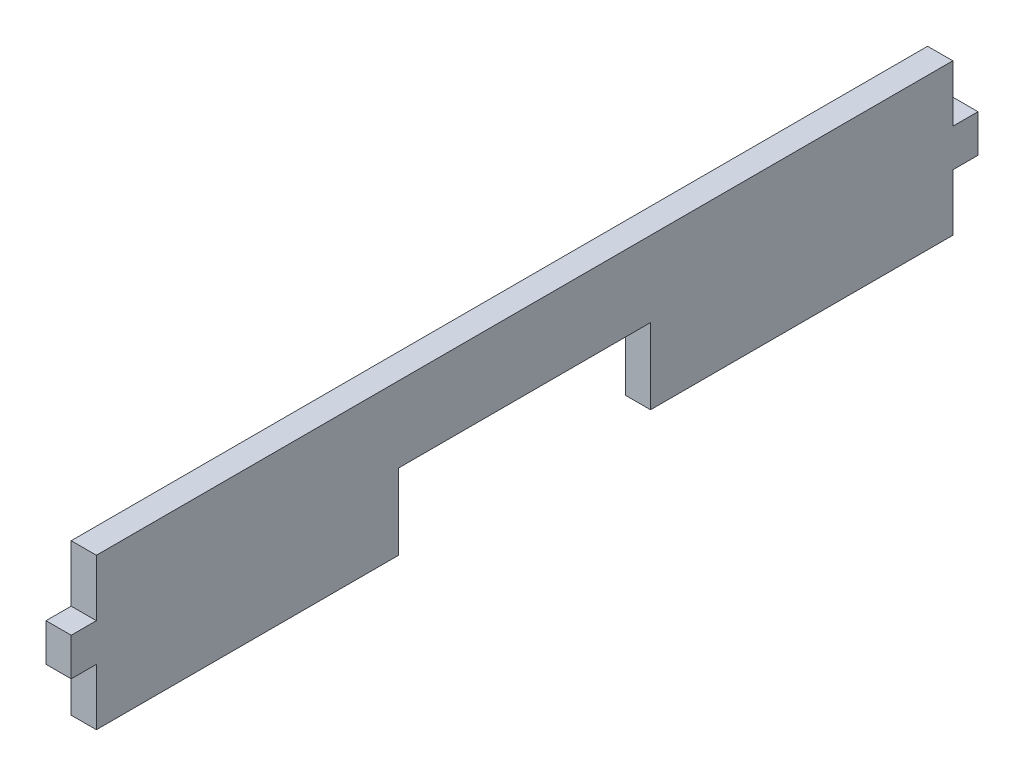
ISO-10303-21;
HEADER;
FILE_DESCRIPTION(('STEP AP214'),'2;1');
FILE_NAME('part.step','',(''),(''),'','','');
FILE_SCHEMA(('AUTOMOTIVE_DESIGN { 1 0 10303 214 1 1 1 1 }'));
ENDSEC;
DATA;
#1=APPLICATION_CONTEXT('core data for automotive mechanical design processes');
#2=APPLICATION_PROTOCOL_DEFINITION('international standard','automotive_design',2000,#1);
#3=PRODUCT_CONTEXT('',#1,'mechanical');
#4=PRODUCT('Part','Part','',(#3));
#5=PRODUCT_RELATED_PRODUCT_CATEGORY('part','',(#4));
#6=PRODUCT_DEFINITION_FORMATION('','',#4);
#7=PRODUCT_DEFINITION_CONTEXT('part definition',#1,'design');
#8=PRODUCT_DEFINITION('design','',#6,#7);
#9=PRODUCT_DEFINITION_SHAPE('','',#8);
#10=(LENGTH_UNIT() NAMED_UNIT(*) SI_UNIT(.MILLI.,.METRE.));
#11=(NAMED_UNIT(*) PLANE_ANGLE_UNIT() SI_UNIT($,.RADIAN.));
#12=(NAMED_UNIT(*) SI_UNIT($,.STERADIAN.) SOLID_ANGLE_UNIT());
#13=UNCERTAINTY_MEASURE_WITH_UNIT(LENGTH_MEASURE(1.E-05),#10,'distance_accuracy_value','');
#14=(GEOMETRIC_REPRESENTATION_CONTEXT(3) GLOBAL_UNCERTAINTY_ASSIGNED_CONTEXT((#13)) GLOBAL_UNIT_ASSIGNED_CONTEXT((#10,
#11,#12)) REPRESENTATION_CONTEXT('',''));
#15=CARTESIAN_POINT('',(0.,0.,0.));
#16=DIRECTION('',(0.,0.,1.));
#17=DIRECTION('',(1.,0.,0.));
#18=AXIS2_PLACEMENT_3D('',#15,#16,#17);
#19=CARTESIAN_POINT('',(2.54,-7.62,43.18));
#20=DIRECTION('',(0.,1.,0.));
#21=DIRECTION('',(0.,0.,1.));
#22=AXIS2_PLACEMENT_3D('',#19,#20,#21);
#23=PLANE('',#22);
#24=DIRECTION('',(0.,0.,-1.));
#25=VECTOR('',#24,1.);
#26=CARTESIAN_POINT('',(2.54,-7.62,43.18));
#27=LINE('',#26,#25);
#28=CARTESIAN_POINT('',(2.54,-7.62,-12.7));
#29=VERTEX_POINT('',#28);
#30=CARTESIAN_POINT('',(2.54,-7.62,-43.18));
#31=VERTEX_POINT('',#30);
#32=EDGE_CURVE('E58',#29,#31,#27,.T.);
#33=ORIENTED_EDGE('',*,*,#32,.F.);
#34=DIRECTION('',(1.,0.,0.));
#35=VECTOR('',#34,1.);
#36=CARTESIAN_POINT('',(-0.00100000000000013,-7.62,-12.7));
#37=LINE('',#36,#35);
#38=CARTESIAN_POINT('',(0.,-7.62,-12.7));
#39=VERTEX_POINT('',#38);
#40=EDGE_CURVE('E287',#39,#29,#37,.T.);
#41=ORIENTED_EDGE('',*,*,#40,.F.);
#42=DIRECTION('',(0.,0.,-1.));
#43=VECTOR('',#42,1.);
#44=CARTESIAN_POINT('',(0.,-7.62,43.18));
#45=LINE('',#44,#43);
#46=CARTESIAN_POINT('',(0.,-7.62,-43.18));
#47=VERTEX_POINT('',#46);
#48=EDGE_CURVE('E104',#39,#47,#45,.T.);
#49=ORIENTED_EDGE('',*,*,#48,.T.);
#50=DIRECTION('',(-1.,0.,0.));
#51=VECTOR('',#50,1.);
#52=CARTESIAN_POINT('',(2.54,-7.62,-43.18));
#53=LINE('',#52,#51);
#54=EDGE_CURVE('E170',#31,#47,#53,.T.);
#55=ORIENTED_EDGE('',*,*,#54,.F.);
#56=EDGE_LOOP('',(#33,#41,#49,#55));
#57=FACE_BOUND('',#56,.T.);
#58=ADVANCED_FACE('F34',(#57),#23,.F.);
#59=CARTESIAN_POINT('',(2.54,-1.90500000000001,-43.18));
#60=DIRECTION('',(0.,0.,1.));
#61=DIRECTION('',(1.,0.,0.));
#62=AXIS2_PLACEMENT_3D('',#59,#60,#61);
#63=PLANE('',#62);
#64=DIRECTION('',(0.,1.,0.));
#65=VECTOR('',#64,1.);
#66=CARTESIAN_POINT('',(0.,-1.90500000000001,-43.18));
#67=LINE('',#66,#65);
#68=CARTESIAN_POINT('',(0.,-1.90500000000001,-43.18));
#69=VERTEX_POINT('',#68);
#70=EDGE_CURVE('E171',#47,#69,#67,.T.);
#71=ORIENTED_EDGE('',*,*,#70,.T.);
#72=DIRECTION('',(-1.,0.,0.));
#73=VECTOR('',#72,1.);
#74=CARTESIAN_POINT('',(2.54,-1.90500000000001,-43.18));
#75=LINE('',#74,#73);
#76=CARTESIAN_POINT('',(2.54,-1.90500000000001,-43.18));
#77=VERTEX_POINT('',#76);
#78=EDGE_CURVE('E11',#77,#69,#75,.T.);
#79=ORIENTED_EDGE('',*,*,#78,.F.);
#80=DIRECTION('',(0.,1.,0.));
#81=VECTOR('',#80,1.);
#82=CARTESIAN_POINT('',(2.54,-1.90500000000001,-43.18));
#83=LINE('',#82,#81);
#84=EDGE_CURVE('E197',#31,#77,#83,.T.);
#85=ORIENTED_EDGE('',*,*,#84,.F.);
#86=ORIENTED_EDGE('',*,*,#54,.T.);
#87=EDGE_LOOP('',(#71,#79,#85,#86));
#88=FACE_BOUND('',#87,.T.);
#89=ADVANCED_FACE('F36',(#88),#63,.F.);
#90=CARTESIAN_POINT('',(2.54,-1.90500000000001,-45.72));
#91=DIRECTION('',(0.,1.,0.));
#92=DIRECTION('',(0.,0.,1.));
#93=AXIS2_PLACEMENT_3D('',#90,#91,#92);
#94=PLANE('',#93);
#95=DIRECTION('',(0.,0.,-1.));
#96=VECTOR('',#95,1.);
#97=CARTESIAN_POINT('',(0.,-1.90500000000001,-45.72));
#98=LINE('',#97,#96);
#99=CARTESIAN_POINT('',(0.,-1.90500000000001,-45.72));
#100=VERTEX_POINT('',#99);
#101=EDGE_CURVE('E174',#69,#100,#98,.T.);
#102=ORIENTED_EDGE('',*,*,#101,.T.);
#103=DIRECTION('',(-1.,0.,0.));
#104=VECTOR('',#103,1.);
#105=CARTESIAN_POINT('',(2.54,-1.90500000000001,-45.72));
#106=LINE('',#105,#104);
#107=CARTESIAN_POINT('',(2.54,-1.90500000000001,-45.72));
#108=VERTEX_POINT('',#107);
#109=EDGE_CURVE('E42',#108,#100,#106,.T.);
#110=ORIENTED_EDGE('',*,*,#109,.F.);
#111=DIRECTION('',(0.,0.,-1.));
#112=VECTOR('',#111,1.);
#113=CARTESIAN_POINT('',(2.54,-1.90500000000001,-45.72));
#114=LINE('',#113,#112);
#115=EDGE_CURVE('E112',#77,#108,#114,.T.);
#116=ORIENTED_EDGE('',*,*,#115,.F.);
#117=ORIENTED_EDGE('',*,*,#78,.T.);
#118=EDGE_LOOP('',(#102,#110,#116,#117));
#119=FACE_BOUND('',#118,.T.);
#120=ADVANCED_FACE('F329',(#119),#94,.F.);
#121=CARTESIAN_POINT('',(2.54,1.90500000000001,-45.72));
#122=DIRECTION('',(0.,0.,1.));
#123=DIRECTION('',(1.,0.,0.));
#124=AXIS2_PLACEMENT_3D('',#121,#122,#123);
#125=PLANE('',#124);
#126=DIRECTION('',(0.,1.,0.));
#127=VECTOR('',#126,1.);
#128=CARTESIAN_POINT('',(0.,1.90500000000001,-45.72));
#129=LINE('',#128,#127);
#130=CARTESIAN_POINT('',(0.,1.90500000000001,-45.72));
#131=VERTEX_POINT('',#130);
#132=EDGE_CURVE('E177',#100,#131,#129,.T.);
#133=ORIENTED_EDGE('',*,*,#132,.T.);
#134=DIRECTION('',(-1.,0.,0.));
#135=VECTOR('',#134,1.);
#136=CARTESIAN_POINT('',(2.54,1.90500000000001,-45.72));
#137=LINE('',#136,#135);
#138=CARTESIAN_POINT('',(2.54,1.90500000000001,-45.72));
#139=VERTEX_POINT('',#138);
#140=EDGE_CURVE('E216',#139,#131,#137,.T.);
#141=ORIENTED_EDGE('',*,*,#140,.F.);
#142=DIRECTION('',(0.,1.,0.));
#143=VECTOR('',#142,1.);
#144=CARTESIAN_POINT('',(2.54,1.90500000000001,-45.72));
#145=LINE('',#144,#143);
#146=EDGE_CURVE('E224',#108,#139,#145,.T.);
#147=ORIENTED_EDGE('',*,*,#146,.F.);
#148=ORIENTED_EDGE('',*,*,#109,.T.);
#149=EDGE_LOOP('',(#133,#141,#147,#148));
#150=FACE_BOUND('',#149,.T.);
#151=ADVANCED_FACE('F222',(#150),#125,.F.);
#152=CARTESIAN_POINT('',(2.54,1.90500000000001,-43.18));
#153=DIRECTION('',(0.,-1.,0.));
#154=DIRECTION('',(0.,0.,-1.));
#155=AXIS2_PLACEMENT_3D('',#152,#153,#154);
#156=PLANE('',#155);
#157=DIRECTION('',(0.,0.,1.));
#158=VECTOR('',#157,1.);
#159=CARTESIAN_POINT('',(0.,1.90500000000001,-43.18));
#160=LINE('',#159,#158);
#161=CARTESIAN_POINT('',(0.,1.90500000000001,-43.18));
#162=VERTEX_POINT('',#161);
#163=EDGE_CURVE('E179',#131,#162,#160,.T.);
#164=ORIENTED_EDGE('',*,*,#163,.T.);
#165=DIRECTION('',(-1.,0.,0.));
#166=VECTOR('',#165,1.);
#167=CARTESIAN_POINT('',(2.54,1.90500000000001,-43.18));
#168=LINE('',#167,#166);
#169=CARTESIAN_POINT('',(2.54,1.90500000000001,-43.18));
#170=VERTEX_POINT('',#169);
#171=EDGE_CURVE('E213',#170,#162,#168,.T.);
#172=ORIENTED_EDGE('',*,*,#171,.F.);
#173=DIRECTION('',(0.,0.,1.));
#174=VECTOR('',#173,1.);
#175=CARTESIAN_POINT('',(2.54,1.90500000000001,-43.18));
#176=LINE('',#175,#174);
#177=EDGE_CURVE('E242',#139,#170,#176,.T.);
#178=ORIENTED_EDGE('',*,*,#177,.F.);
#179=ORIENTED_EDGE('',*,*,#140,.T.);
#180=EDGE_LOOP('',(#164,#172,#178,#179));
#181=FACE_BOUND('',#180,.T.);
#182=ADVANCED_FACE('F233',(#181),#156,.F.);
#183=CARTESIAN_POINT('',(2.54,7.62,-43.18));
#184=DIRECTION('',(0.,0.,1.));
#185=DIRECTION('',(1.,0.,0.));
#186=AXIS2_PLACEMENT_3D('',#183,#184,#185);
#187=PLANE('',#186);
#188=DIRECTION('',(0.,1.,0.));
#189=VECTOR('',#188,1.);
#190=CARTESIAN_POINT('',(0.,7.62,-43.18));
#191=LINE('',#190,#189);
#192=CARTESIAN_POINT('',(0.,7.62,-43.18));
#193=VERTEX_POINT('',#192);
#194=EDGE_CURVE('E181',#162,#193,#191,.T.);
#195=ORIENTED_EDGE('',*,*,#194,.T.);
#196=DIRECTION('',(-1.,0.,0.));
#197=VECTOR('',#196,1.);
#198=CARTESIAN_POINT('',(2.54,7.62,-43.18));
#199=LINE('',#198,#197);
#200=CARTESIAN_POINT('',(2.54,7.62,-43.18));
#201=VERTEX_POINT('',#200);
#202=EDGE_CURVE('E210',#201,#193,#199,.T.);
#203=ORIENTED_EDGE('',*,*,#202,.F.);
#204=DIRECTION('',(0.,1.,0.));
#205=VECTOR('',#204,1.);
#206=CARTESIAN_POINT('',(2.54,7.62,-43.18));
#207=LINE('',#206,#205);
#208=EDGE_CURVE('E239',#170,#201,#207,.T.);
#209=ORIENTED_EDGE('',*,*,#208,.F.);
#210=ORIENTED_EDGE('',*,*,#171,.T.);
#211=EDGE_LOOP('',(#195,#203,#209,#210));
#212=FACE_BOUND('',#211,.T.);
#213=ADVANCED_FACE('F237',(#212),#187,.F.);
#214=CARTESIAN_POINT('',(2.54,7.62,43.18));
#215=DIRECTION('',(0.,-1.,0.));
#216=DIRECTION('',(0.,0.,-1.));
#217=AXIS2_PLACEMENT_3D('',#214,#215,#216);
#218=PLANE('',#217);
#219=DIRECTION('',(0.,0.,1.));
#220=VECTOR('',#219,1.);
#221=CARTESIAN_POINT('',(0.,7.62,43.18));
#222=LINE('',#221,#220);
#223=CARTESIAN_POINT('',(0.,7.62,43.18));
#224=VERTEX_POINT('',#223);
#225=EDGE_CURVE('E183',#193,#224,#222,.T.);
#226=ORIENTED_EDGE('',*,*,#225,.T.);
#227=DIRECTION('',(-1.,0.,0.));
#228=VECTOR('',#227,1.);
#229=CARTESIAN_POINT('',(2.54,7.62,43.18));
#230=LINE('',#229,#228);
#231=CARTESIAN_POINT('',(2.54,7.62,43.18));
#232=VERTEX_POINT('',#231);
#233=EDGE_CURVE('E207',#232,#224,#230,.T.);
#234=ORIENTED_EDGE('',*,*,#233,.F.);
#235=DIRECTION('',(0.,0.,1.));
#236=VECTOR('',#235,1.);
#237=CARTESIAN_POINT('',(2.54,7.62,43.18));
#238=LINE('',#237,#236);
#239=EDGE_CURVE('E241',#201,#232,#238,.T.);
#240=ORIENTED_EDGE('',*,*,#239,.F.);
#241=ORIENTED_EDGE('',*,*,#202,.T.);
#242=EDGE_LOOP('',(#226,#234,#240,#241));
#243=FACE_BOUND('',#242,.T.);
#244=ADVANCED_FACE('F350',(#243),#218,.F.);
#245=CARTESIAN_POINT('',(2.54,7.62,43.18));
#246=DIRECTION('',(0.,0.,-1.));
#247=DIRECTION('',(-1.,0.,0.));
#248=AXIS2_PLACEMENT_3D('',#245,#246,#247);
#249=PLANE('',#248);
#250=DIRECTION('',(0.,-1.,0.));
#251=VECTOR('',#250,1.);
#252=CARTESIAN_POINT('',(0.,7.62,43.18));
#253=LINE('',#252,#251);
#254=CARTESIAN_POINT('',(0.,1.905,43.18));
#255=VERTEX_POINT('',#254);
#256=EDGE_CURVE('E185',#224,#255,#253,.T.);
#257=ORIENTED_EDGE('',*,*,#256,.T.);
#258=DIRECTION('',(-1.,0.,0.));
#259=VECTOR('',#258,1.);
#260=CARTESIAN_POINT('',(2.54,1.905,43.18));
#261=LINE('',#260,#259);
#262=CARTESIAN_POINT('',(2.54,1.905,43.18));
#263=VERTEX_POINT('',#262);
#264=EDGE_CURVE('E204',#263,#255,#261,.T.);
#265=ORIENTED_EDGE('',*,*,#264,.F.);
#266=DIRECTION('',(0.,-1.,0.));
#267=VECTOR('',#266,1.);
#268=CARTESIAN_POINT('',(2.54,7.62,43.18));
#269=LINE('',#268,#267);
#270=EDGE_CURVE('E244',#232,#263,#269,.T.);
#271=ORIENTED_EDGE('',*,*,#270,.F.);
#272=ORIENTED_EDGE('',*,*,#233,.T.);
#273=EDGE_LOOP('',(#257,#265,#271,#272));
#274=FACE_BOUND('',#273,.T.);
#275=ADVANCED_FACE('F347',(#274),#249,.F.);
#276=CARTESIAN_POINT('',(2.54,1.905,43.18));
#277=DIRECTION('',(0.,-1.,0.));
#278=DIRECTION('',(0.,0.,-1.));
#279=AXIS2_PLACEMENT_3D('',#276,#277,#278);
#280=PLANE('',#279);
#281=DIRECTION('',(0.,0.,1.));
#282=VECTOR('',#281,1.);
#283=CARTESIAN_POINT('',(0.,1.905,43.18));
#284=LINE('',#283,#282);
#285=CARTESIAN_POINT('',(0.,1.905,45.72));
#286=VERTEX_POINT('',#285);
#287=EDGE_CURVE('E187',#255,#286,#284,.T.);
#288=ORIENTED_EDGE('',*,*,#287,.T.);
#289=DIRECTION('',(-1.,0.,0.));
#290=VECTOR('',#289,1.);
#291=CARTESIAN_POINT('',(2.54,1.905,45.72));
#292=LINE('',#291,#290);
#293=CARTESIAN_POINT('',(2.54,1.905,45.72));
#294=VERTEX_POINT('',#293);
#295=EDGE_CURVE('E201',#294,#286,#292,.T.);
#296=ORIENTED_EDGE('',*,*,#295,.F.);
#297=DIRECTION('',(0.,0.,1.));
#298=VECTOR('',#297,1.);
#299=CARTESIAN_POINT('',(2.54,1.905,43.18));
#300=LINE('',#299,#298);
#301=EDGE_CURVE('E250',#263,#294,#300,.T.);
#302=ORIENTED_EDGE('',*,*,#301,.F.);
#303=ORIENTED_EDGE('',*,*,#264,.T.);
#304=EDGE_LOOP('',(#288,#296,#302,#303));
#305=FACE_BOUND('',#304,.T.);
#306=ADVANCED_FACE('F256',(#305),#280,.F.);
#307=CARTESIAN_POINT('',(2.54,1.905,45.72));
#308=DIRECTION('',(0.,0.,-1.));
#309=DIRECTION('',(-1.,0.,0.));
#310=AXIS2_PLACEMENT_3D('',#307,#308,#309);
#311=PLANE('',#310);
#312=DIRECTION('',(0.,-1.,0.));
#313=VECTOR('',#312,1.);
#314=CARTESIAN_POINT('',(0.,1.905,45.72));
#315=LINE('',#314,#313);
#316=CARTESIAN_POINT('',(0.,-1.905,45.72));
#317=VERTEX_POINT('',#316);
#318=EDGE_CURVE('E189',#286,#317,#315,.T.);
#319=ORIENTED_EDGE('',*,*,#318,.T.);
#320=DIRECTION('',(-1.,0.,0.));
#321=VECTOR('',#320,1.);
#322=CARTESIAN_POINT('',(2.54,-1.905,45.72));
#323=LINE('',#322,#321);
#324=CARTESIAN_POINT('',(2.54,-1.905,45.72));
#325=VERTEX_POINT('',#324);
#326=EDGE_CURVE('E159',#325,#317,#323,.T.);
#327=ORIENTED_EDGE('',*,*,#326,.F.);
#328=DIRECTION('',(0.,-1.,0.));
#329=VECTOR('',#328,1.);
#330=CARTESIAN_POINT('',(2.54,1.905,45.72));
#331=LINE('',#330,#329);
#332=EDGE_CURVE('E147',#294,#325,#331,.T.);
#333=ORIENTED_EDGE('',*,*,#332,.F.);
#334=ORIENTED_EDGE('',*,*,#295,.T.);
#335=EDGE_LOOP('',(#319,#327,#333,#334));
#336=FACE_BOUND('',#335,.T.);
#337=ADVANCED_FACE('F260',(#336),#311,.F.);
#338=CARTESIAN_POINT('',(2.54,-1.905,45.72));
#339=DIRECTION('',(0.,1.,0.));
#340=DIRECTION('',(0.,0.,1.));
#341=AXIS2_PLACEMENT_3D('',#338,#339,#340);
#342=PLANE('',#341);
#343=DIRECTION('',(0.,0.,-1.));
#344=VECTOR('',#343,1.);
#345=CARTESIAN_POINT('',(0.,-1.905,45.72));
#346=LINE('',#345,#344);
#347=CARTESIAN_POINT('',(0.,-1.905,43.18));
#348=VERTEX_POINT('',#347);
#349=EDGE_CURVE('E156',#317,#348,#346,.T.);
#350=ORIENTED_EDGE('',*,*,#349,.T.);
#351=DIRECTION('',(-1.,0.,0.));
#352=VECTOR('',#351,1.);
#353=CARTESIAN_POINT('',(2.54,-1.905,43.18));
#354=LINE('',#353,#352);
#355=CARTESIAN_POINT('',(2.54,-1.905,43.18));
#356=VERTEX_POINT('',#355);
#357=EDGE_CURVE('E153',#356,#348,#354,.T.);
#358=ORIENTED_EDGE('',*,*,#357,.F.);
#359=DIRECTION('',(0.,0.,-1.));
#360=VECTOR('',#359,1.);
#361=CARTESIAN_POINT('',(2.54,-1.905,45.72));
#362=LINE('',#361,#360);
#363=EDGE_CURVE('E139',#325,#356,#362,.T.);
#364=ORIENTED_EDGE('',*,*,#363,.F.);
#365=ORIENTED_EDGE('',*,*,#326,.T.);
#366=EDGE_LOOP('',(#350,#358,#364,#365));
#367=FACE_BOUND('',#366,.T.);
#368=ADVANCED_FACE('F154',(#367),#342,.F.);
#369=CARTESIAN_POINT('',(2.54,-1.905,43.18));
#370=DIRECTION('',(0.,0.,-1.));
#371=DIRECTION('',(-1.,0.,0.));
#372=AXIS2_PLACEMENT_3D('',#369,#370,#371);
#373=PLANE('',#372);
#374=DIRECTION('',(0.,-1.,0.));
#375=VECTOR('',#374,1.);
#376=CARTESIAN_POINT('',(0.,-1.905,43.18));
#377=LINE('',#376,#375);
#378=CARTESIAN_POINT('',(0.,-7.62,43.18));
#379=VERTEX_POINT('',#378);
#380=EDGE_CURVE('E192',#348,#379,#377,.T.);
#381=ORIENTED_EDGE('',*,*,#380,.T.);
#382=DIRECTION('',(-1.,0.,0.));
#383=VECTOR('',#382,1.);
#384=CARTESIAN_POINT('',(2.54,-7.62,43.18));
#385=LINE('',#384,#383);
#386=CARTESIAN_POINT('',(2.54,-7.62,43.18));
#387=VERTEX_POINT('',#386);
#388=EDGE_CURVE('E160',#387,#379,#385,.T.);
#389=ORIENTED_EDGE('',*,*,#388,.F.);
#390=DIRECTION('',(0.,-1.,0.));
#391=VECTOR('',#390,1.);
#392=CARTESIAN_POINT('',(2.54,-1.905,43.18));
#393=LINE('',#392,#391);
#394=EDGE_CURVE('E144',#356,#387,#393,.T.);
#395=ORIENTED_EDGE('',*,*,#394,.F.);
#396=ORIENTED_EDGE('',*,*,#357,.T.);
#397=EDGE_LOOP('',(#381,#389,#395,#396));
#398=FACE_BOUND('',#397,.T.);
#399=ADVANCED_FACE('F162',(#398),#373,.F.);
#400=CARTESIAN_POINT('',(0.,-7.62,12.7));
#401=VERTEX_POINT('',#400);
#402=EDGE_CURVE('E194',#379,#401,#45,.T.);
#403=ORIENTED_EDGE('',*,*,#402,.T.);
#404=DIRECTION('',(1.,0.,0.));
#405=VECTOR('',#404,1.);
#406=CARTESIAN_POINT('',(-0.00100000000000013,-7.62,12.7));
#407=LINE('',#406,#405);
#408=CARTESIAN_POINT('',(2.54,-7.62,12.7));
#409=VERTEX_POINT('',#408);
#410=EDGE_CURVE('E267',#401,#409,#407,.T.);
#411=ORIENTED_EDGE('',*,*,#410,.T.);
#412=EDGE_CURVE('E166',#387,#409,#27,.T.);
#413=ORIENTED_EDGE('',*,*,#412,.F.);
#414=ORIENTED_EDGE('',*,*,#388,.T.);
#415=EDGE_LOOP('',(#403,#411,#413,#414));
#416=FACE_BOUND('',#415,.T.);
#417=ADVANCED_FACE('F263',(#416),#23,.F.);
#418=CARTESIAN_POINT('',(2.54,0.,0.));
#419=DIRECTION('',(1.,0.,0.));
#420=DIRECTION('',(0.,0.,-1.));
#421=AXIS2_PLACEMENT_3D('',#418,#419,#420);
#422=PLANE('',#421);
#423=DIRECTION('',(0.,1.,0.));
#424=VECTOR('',#423,1.);
#425=CARTESIAN_POINT('',(2.54,0.,-12.7));
#426=LINE('',#425,#424);
#427=CARTESIAN_POINT('',(2.54,0.,-12.7));
#428=VERTEX_POINT('',#427);
#429=EDGE_CURVE('E293',#29,#428,#426,.T.);
#430=ORIENTED_EDGE('',*,*,#429,.F.);
#431=ORIENTED_EDGE('',*,*,#32,.T.);
#432=ORIENTED_EDGE('',*,*,#84,.T.);
#433=ORIENTED_EDGE('',*,*,#115,.T.);
#434=ORIENTED_EDGE('',*,*,#146,.T.);
#435=ORIENTED_EDGE('',*,*,#177,.T.);
#436=ORIENTED_EDGE('',*,*,#208,.T.);
#437=ORIENTED_EDGE('',*,*,#239,.T.);
#438=ORIENTED_EDGE('',*,*,#270,.T.);
#439=ORIENTED_EDGE('',*,*,#301,.T.);
#440=ORIENTED_EDGE('',*,*,#332,.T.);
#441=ORIENTED_EDGE('',*,*,#363,.T.);
#442=ORIENTED_EDGE('',*,*,#394,.T.);
#443=ORIENTED_EDGE('',*,*,#412,.T.);
#444=DIRECTION('',(0.,-1.,0.));
#445=VECTOR('',#444,1.);
#446=CARTESIAN_POINT('',(2.54,0.,12.7));
#447=LINE('',#446,#445);
#448=CARTESIAN_POINT('',(2.54,0.,12.7));
#449=VERTEX_POINT('',#448);
#450=EDGE_CURVE('E272',#449,#409,#447,.T.);
#451=ORIENTED_EDGE('',*,*,#450,.F.);
#452=DIRECTION('',(0.,0.,1.));
#453=VECTOR('',#452,1.);
#454=CARTESIAN_POINT('',(2.54,0.,12.7));
#455=LINE('',#454,#453);
#456=EDGE_CURVE('E308',#428,#449,#455,.T.);
#457=ORIENTED_EDGE('',*,*,#456,.F.);
#458=EDGE_LOOP('',(#430,#431,#432,#433,#434,#435,#436,#437,#438,#439,#440,#441,#442,#443,#451,#457));
#459=FACE_BOUND('',#458,.T.);
#460=ADVANCED_FACE('F141',(#459),#422,.T.);
#461=CARTESIAN_POINT('',(0.,0.,0.));
#462=DIRECTION('',(1.,0.,0.));
#463=DIRECTION('',(0.,0.,-1.));
#464=AXIS2_PLACEMENT_3D('',#461,#462,#463);
#465=PLANE('',#464);
#466=ORIENTED_EDGE('',*,*,#48,.F.);
#467=DIRECTION('',(0.,-1.,0.));
#468=VECTOR('',#467,1.);
#469=CARTESIAN_POINT('',(0.,0.,-12.7));
#470=LINE('',#469,#468);
#471=CARTESIAN_POINT('',(0.,0.,-12.7));
#472=VERTEX_POINT('',#471);
#473=EDGE_CURVE('E284',#472,#39,#470,.T.);
#474=ORIENTED_EDGE('',*,*,#473,.F.);
#475=DIRECTION('',(0.,0.,-1.));
#476=VECTOR('',#475,1.);
#477=CARTESIAN_POINT('',(0.,0.,12.7));
#478=LINE('',#477,#476);
#479=CARTESIAN_POINT('',(0.,0.,12.7));
#480=VERTEX_POINT('',#479);
#481=EDGE_CURVE('E175',#480,#472,#478,.T.);
#482=ORIENTED_EDGE('',*,*,#481,.F.);
#483=DIRECTION('',(0.,1.,0.));
#484=VECTOR('',#483,1.);
#485=CARTESIAN_POINT('',(0.,0.,12.7));
#486=LINE('',#485,#484);
#487=EDGE_CURVE('E49',#401,#480,#486,.T.);
#488=ORIENTED_EDGE('',*,*,#487,.F.);
#489=ORIENTED_EDGE('',*,*,#402,.F.);
#490=ORIENTED_EDGE('',*,*,#380,.F.);
#491=ORIENTED_EDGE('',*,*,#349,.F.);
#492=ORIENTED_EDGE('',*,*,#318,.F.);
#493=ORIENTED_EDGE('',*,*,#287,.F.);
#494=ORIENTED_EDGE('',*,*,#256,.F.);
#495=ORIENTED_EDGE('',*,*,#225,.F.);
#496=ORIENTED_EDGE('',*,*,#194,.F.);
#497=ORIENTED_EDGE('',*,*,#163,.F.);
#498=ORIENTED_EDGE('',*,*,#132,.F.);
#499=ORIENTED_EDGE('',*,*,#101,.F.);
#500=ORIENTED_EDGE('',*,*,#70,.F.);
#501=EDGE_LOOP('',(#466,#474,#482,#488,#489,#490,#491,#492,#493,#494,#495,#496,#497,#498,#499,#500));
#502=FACE_BOUND('',#501,.T.);
#503=ADVANCED_FACE('F227',(#502),#465,.F.);
#504=CARTESIAN_POINT('',(-0.00100000000000013,0.,-12.7));
#505=DIRECTION('',(0.,0.,-1.));
#506=DIRECTION('',(-1.,0.,0.));
#507=AXIS2_PLACEMENT_3D('',#504,#505,#506);
#508=PLANE('',#507);
#509=ORIENTED_EDGE('',*,*,#473,.T.);
#510=ORIENTED_EDGE('',*,*,#40,.T.);
#511=ORIENTED_EDGE('',*,*,#429,.T.);
#512=DIRECTION('',(1.,0.,0.));
#513=VECTOR('',#512,1.);
#514=CARTESIAN_POINT('',(-0.00100000000000013,0.,-12.7));
#515=LINE('',#514,#513);
#516=EDGE_CURVE('E290',#472,#428,#515,.T.);
#517=ORIENTED_EDGE('',*,*,#516,.F.);
#518=EDGE_LOOP('',(#509,#510,#511,#517));
#519=FACE_BOUND('',#518,.T.);
#520=ADVANCED_FACE('F285',(#519),#508,.F.);
#521=CARTESIAN_POINT('',(-0.00100000000000013,0.,12.7));
#522=DIRECTION('',(0.,0.,1.));
#523=DIRECTION('',(1.,0.,0.));
#524=AXIS2_PLACEMENT_3D('',#521,#522,#523);
#525=PLANE('',#524);
#526=ORIENTED_EDGE('',*,*,#487,.T.);
#527=DIRECTION('',(1.,0.,0.));
#528=VECTOR('',#527,1.);
#529=CARTESIAN_POINT('',(-0.00100000000000013,0.,12.7));
#530=LINE('',#529,#528);
#531=EDGE_CURVE('E304',#480,#449,#530,.T.);
#532=ORIENTED_EDGE('',*,*,#531,.T.);
#533=ORIENTED_EDGE('',*,*,#450,.T.);
#534=ORIENTED_EDGE('',*,*,#410,.F.);
#535=EDGE_LOOP('',(#526,#532,#533,#534));
#536=FACE_BOUND('',#535,.T.);
#537=ADVANCED_FACE('F315',(#536),#525,.F.);
#538=CARTESIAN_POINT('',(-0.00100000000000013,0.,12.7));
#539=DIRECTION('',(0.,1.,0.));
#540=DIRECTION('',(0.,0.,1.));
#541=AXIS2_PLACEMENT_3D('',#538,#539,#540);
#542=PLANE('',#541);
#543=ORIENTED_EDGE('',*,*,#481,.T.);
#544=ORIENTED_EDGE('',*,*,#516,.T.);
#545=ORIENTED_EDGE('',*,*,#456,.T.);
#546=ORIENTED_EDGE('',*,*,#531,.F.);
#547=EDGE_LOOP('',(#543,#544,#545,#546));
#548=FACE_BOUND('',#547,.T.);
#549=ADVANCED_FACE('F313',(#548),#542,.F.);
#550=CLOSED_SHELL('',(#58,#89,#120,#151,#182,#213,#244,#275,#306,#337,#368,#399,#417,#460,#503,
#520,#537,#549));
#551=MANIFOLD_SOLID_BREP('B2',#550);
#552=ADVANCED_BREP_SHAPE_REPRESENTATION('',(#18,#551),#14);
#553=SHAPE_DEFINITION_REPRESENTATION(#9,#552);
ENDSEC;
END-ISO-10303-21;
